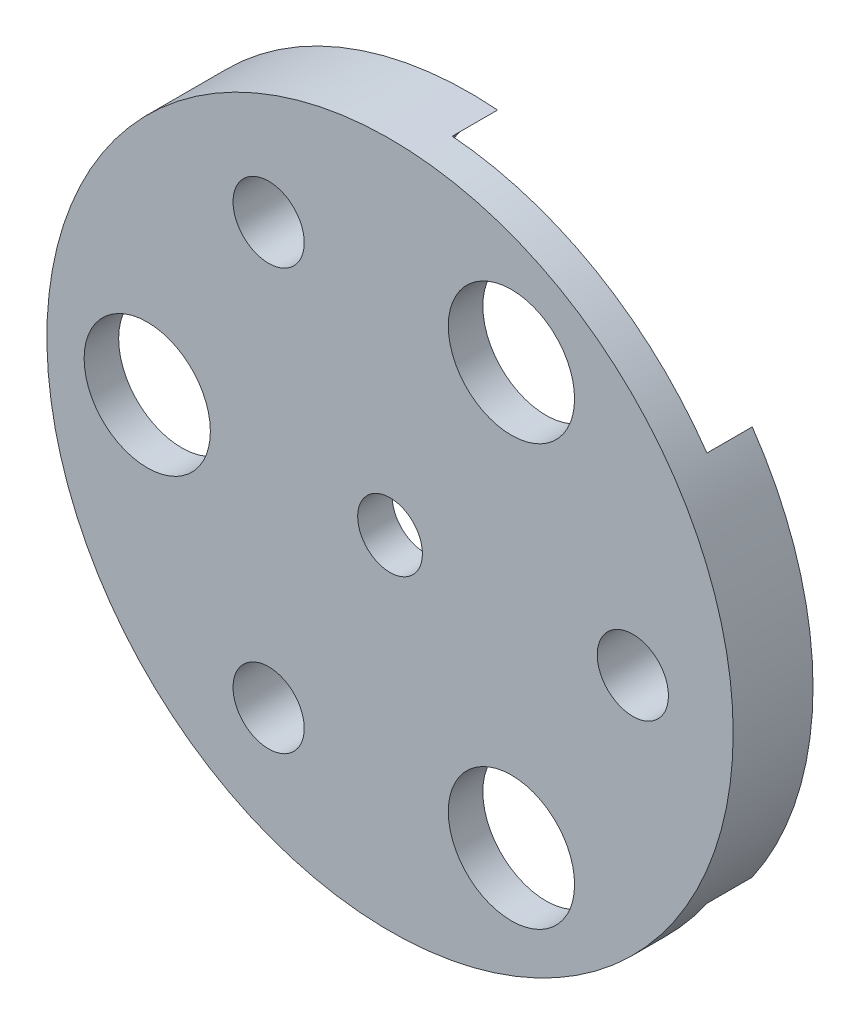
ISO-10303-21;
HEADER;
FILE_DESCRIPTION(('STEP AP214'),'2;1');
FILE_NAME('part.step','',(''),(''),'','','');
FILE_SCHEMA(('AUTOMOTIVE_DESIGN { 1 0 10303 214 1 1 1 1 }'));
ENDSEC;
DATA;
#1=APPLICATION_CONTEXT('core data for automotive mechanical design processes');
#2=APPLICATION_PROTOCOL_DEFINITION('international standard','automotive_design',2000,#1);
#3=PRODUCT_CONTEXT('',#1,'mechanical');
#4=PRODUCT('Part','Part','',(#3));
#5=PRODUCT_RELATED_PRODUCT_CATEGORY('part','',(#4));
#6=PRODUCT_DEFINITION_FORMATION('','',#4);
#7=PRODUCT_DEFINITION_CONTEXT('part definition',#1,'design');
#8=PRODUCT_DEFINITION('design','',#6,#7);
#9=PRODUCT_DEFINITION_SHAPE('','',#8);
#10=(LENGTH_UNIT() NAMED_UNIT(*) SI_UNIT(.MILLI.,.METRE.));
#11=(NAMED_UNIT(*) PLANE_ANGLE_UNIT() SI_UNIT($,.RADIAN.));
#12=(NAMED_UNIT(*) SI_UNIT($,.STERADIAN.) SOLID_ANGLE_UNIT());
#13=UNCERTAINTY_MEASURE_WITH_UNIT(LENGTH_MEASURE(1.E-05),#10,'distance_accuracy_value','');
#14=(GEOMETRIC_REPRESENTATION_CONTEXT(3) GLOBAL_UNCERTAINTY_ASSIGNED_CONTEXT((#13)) GLOBAL_UNIT_ASSIGNED_CONTEXT((#10,
#11,#12)) REPRESENTATION_CONTEXT('',''));
#15=CARTESIAN_POINT('',(0.,0.,0.));
#16=DIRECTION('',(0.,0.,1.));
#17=DIRECTION('',(1.,0.,0.));
#18=AXIS2_PLACEMENT_3D('',#15,#16,#17);
#19=CARTESIAN_POINT('',(169.819947443617,173.617651356682,0.));
#20=DIRECTION('',(0.,0.,1.));
#21=DIRECTION('',(1.,0.,0.));
#22=AXIS2_PLACEMENT_3D('',#19,#20,#21);
#23=PLANE('',#22);
#24=CARTESIAN_POINT('',(164.194947443617,163.874865564107,0.));
#25=DIRECTION('',(0.,0.,1.));
#26=DIRECTION('',(1.,0.,0.));
#27=AXIS2_PLACEMENT_3D('',#24,#25,#26);
#28=CIRCLE('',#27,1.65000000000001);
#29=CARTESIAN_POINT('',(165.844947443617,163.874865564107,0.));
#30=VERTEX_POINT('',#29);
#31=EDGE_CURVE('E216',#30,#30,#28,.T.);
#32=ORIENTED_EDGE('',*,*,#31,.T.);
#33=EDGE_LOOP('',(#32));
#34=FACE_BOUND('',#33,.T.);
#35=CARTESIAN_POINT('',(169.819947443617,173.617651356682,0.));
#36=DIRECTION('',(0.,0.,1.));
#37=DIRECTION('',(1.,0.,0.));
#38=AXIS2_PLACEMENT_3D('',#35,#36,#37);
#39=CIRCLE('',#38,15.9);
#40=CARTESIAN_POINT('',(155.453613863203,166.804541974303,0.));
#41=VERTEX_POINT('',#40);
#42=CARTESIAN_POINT('',(171.102788429923,157.769486825612,0.));
#43=VERTEX_POINT('',#42);
#44=EDGE_CURVE('E169',#41,#43,#39,.T.);
#45=ORIENTED_EDGE('',*,*,#44,.F.);
#46=CARTESIAN_POINT('',(158.569947443617,173.617651356682,0.));
#47=DIRECTION('',(0.,0.,-1.));
#48=DIRECTION('',(-1.,0.,0.));
#49=AXIS2_PLACEMENT_3D('',#46,#47,#48);
#50=CIRCLE('',#49,7.4919953577583);
#51=CARTESIAN_POINT('',(164.29045907,168.779703323363,0.));
#52=VERTEX_POINT('',#51);
#53=EDGE_CURVE('E111',#52,#41,#50,.T.);
#54=ORIENTED_EDGE('',*,*,#53,.F.);
#55=CARTESIAN_POINT('',(169.819947443617,173.617651356682,0.));
#56=DIRECTION('',(0.,0.,-1.));
#57=DIRECTION('',(-1.,0.,0.));
#58=AXIS2_PLACEMENT_3D('',#55,#56,#57);
#59=CIRCLE('',#58,7.34717516104373);
#60=CARTESIAN_POINT('',(168.394905731383,166.409999938539,0.));
#61=VERTEX_POINT('',#60);
#62=EDGE_CURVE('E314',#61,#52,#59,.T.);
#63=ORIENTED_EDGE('',*,*,#62,.F.);
#64=CARTESIAN_POINT('',(175.444947443617,163.874865564107,0.));
#65=DIRECTION('',(0.,0.,-1.));
#66=DIRECTION('',(-1.,0.,0.));
#67=AXIS2_PLACEMENT_3D('',#64,#65,#66);
#68=CIRCLE('',#67,7.4919953577583);
#69=EDGE_CURVE('E360',#43,#61,#68,.T.);
#70=ORIENTED_EDGE('',*,*,#69,.F.);
#71=EDGE_LOOP('',(#45,#54,#63,#70));
#72=FACE_BOUND('',#71,.T.);
#73=ADVANCED_FACE('F43',(#34,#72),#23,.F.);
#74=CARTESIAN_POINT('',(181.069947443617,173.617651356682,0.));
#75=DIRECTION('',(0.,0.,1.));
#76=DIRECTION('',(1.,0.,0.));
#77=AXIS2_PLACEMENT_3D('',#74,#75,#76);
#78=CIRCLE('',#77,1.65000000000002);
#79=CARTESIAN_POINT('',(182.719947443617,173.617651356682,0.));
#80=VERTEX_POINT('',#79);
#81=EDGE_CURVE('E235',#80,#80,#78,.T.);
#82=ORIENTED_EDGE('',*,*,#81,.T.);
#83=EDGE_LOOP('',(#82));
#84=FACE_BOUND('',#83,.T.);
#85=CARTESIAN_POINT('',(182.903440037726,164.58259620799,0.));
#86=VERTEX_POINT('',#85);
#87=CARTESIAN_POINT('',(182.903440037726,182.652706505373,0.));
#88=VERTEX_POINT('',#87);
#89=EDGE_CURVE('E47',#86,#88,#39,.T.);
#90=ORIENTED_EDGE('',*,*,#89,.F.);
#91=CARTESIAN_POINT('',(176.774477529469,171.247947971858,0.));
#92=VERTEX_POINT('',#91);
#93=EDGE_CURVE('E357',#92,#86,#68,.T.);
#94=ORIENTED_EDGE('',*,*,#93,.F.);
#95=CARTESIAN_POINT('',(176.774477529469,175.987354741505,0.));
#96=VERTEX_POINT('',#95);
#97=EDGE_CURVE('E353',#96,#92,#59,.T.);
#98=ORIENTED_EDGE('',*,*,#97,.F.);
#99=CARTESIAN_POINT('',(175.444947443617,183.360437149256,0.));
#100=DIRECTION('',(0.,0.,-1.));
#101=DIRECTION('',(-1.,0.,0.));
#102=AXIS2_PLACEMENT_3D('',#99,#100,#101);
#103=CIRCLE('',#102,7.49199535775831);
#104=EDGE_CURVE('E356',#88,#96,#103,.T.);
#105=ORIENTED_EDGE('',*,*,#104,.F.);
#106=EDGE_LOOP('',(#90,#94,#98,#105));
#107=FACE_BOUND('',#106,.T.);
#108=ADVANCED_FACE('F244',(#84,#107),#23,.F.);
#109=CARTESIAN_POINT('',(158.569947443617,173.617651356682,3.7));
#110=DIRECTION('',(0.,0.,-1.));
#111=DIRECTION('',(-1.,0.,0.));
#112=AXIS2_PLACEMENT_3D('',#109,#110,#111);
#113=CYLINDRICAL_SURFACE('',#112,2.92500000000001);
#114=CARTESIAN_POINT('',(158.569947443617,173.617651356682,3.7));
#115=DIRECTION('',(0.,0.,1.));
#116=DIRECTION('',(1.,0.,0.));
#117=AXIS2_PLACEMENT_3D('',#114,#115,#116);
#118=CIRCLE('',#117,2.92500000000001);
#119=CARTESIAN_POINT('',(161.494947443617,173.617651356682,3.7));
#120=VERTEX_POINT('',#119);
#121=EDGE_CURVE('E231',#120,#120,#118,.T.);
#122=ORIENTED_EDGE('',*,*,#121,.T.);
#123=EDGE_LOOP('',(#122));
#124=FACE_BOUND('',#123,.T.);
#125=CARTESIAN_POINT('',(158.569947443617,173.617651356682,2.1));
#126=DIRECTION('',(0.,0.,-1.));
#127=DIRECTION('',(-1.,0.,0.));
#128=AXIS2_PLACEMENT_3D('',#125,#126,#127);
#129=CIRCLE('',#128,2.92500000000001);
#130=CARTESIAN_POINT('',(155.644947443617,173.617651356682,2.1));
#131=VERTEX_POINT('',#130);
#132=EDGE_CURVE('E304',#131,#131,#129,.F.);
#133=ORIENTED_EDGE('',*,*,#132,.F.);
#134=EDGE_LOOP('',(#133));
#135=FACE_BOUND('',#134,.T.);
#136=ADVANCED_FACE('F265',(#124,#135),#113,.F.);
#137=CARTESIAN_POINT('',(169.819947443617,173.617651356682,3.7));
#138=DIRECTION('',(0.,0.,-1.));
#139=DIRECTION('',(-1.,0.,0.));
#140=AXIS2_PLACEMENT_3D('',#137,#138,#139);
#141=CYLINDRICAL_SURFACE('',#140,1.5);
#142=CARTESIAN_POINT('',(169.819947443617,173.617651356682,3.7));
#143=DIRECTION('',(0.,0.,1.));
#144=DIRECTION('',(1.,0.,0.));
#145=AXIS2_PLACEMENT_3D('',#142,#143,#144);
#146=CIRCLE('',#145,1.5);
#147=CARTESIAN_POINT('',(171.319947443617,173.617651356682,3.7));
#148=VERTEX_POINT('',#147);
#149=EDGE_CURVE('E224',#148,#148,#146,.T.);
#150=ORIENTED_EDGE('',*,*,#149,.T.);
#151=EDGE_LOOP('',(#150));
#152=FACE_BOUND('',#151,.T.);
#153=CARTESIAN_POINT('',(169.819947443617,173.617651356682,2.1));
#154=DIRECTION('',(0.,0.,-1.));
#155=DIRECTION('',(-1.,0.,0.));
#156=AXIS2_PLACEMENT_3D('',#153,#154,#155);
#157=CIRCLE('',#156,1.5);
#158=CARTESIAN_POINT('',(168.319947443617,173.617651356682,2.1));
#159=VERTEX_POINT('',#158);
#160=EDGE_CURVE('E335',#159,#159,#157,.F.);
#161=ORIENTED_EDGE('',*,*,#160,.F.);
#162=EDGE_LOOP('',(#161));
#163=FACE_BOUND('',#162,.T.);
#164=ADVANCED_FACE('F294',(#152,#163),#141,.F.);
#165=CARTESIAN_POINT('',(175.444947443617,183.360437149256,3.7));
#166=DIRECTION('',(0.,0.,-1.));
#167=DIRECTION('',(-1.,0.,0.));
#168=AXIS2_PLACEMENT_3D('',#165,#166,#167);
#169=CYLINDRICAL_SURFACE('',#168,2.925);
#170=CARTESIAN_POINT('',(175.444947443617,183.360437149256,3.7));
#171=DIRECTION('',(0.,0.,1.));
#172=DIRECTION('',(1.,0.,0.));
#173=AXIS2_PLACEMENT_3D('',#170,#171,#172);
#174=CIRCLE('',#173,2.925);
#175=CARTESIAN_POINT('',(178.369947443617,183.360437149256,3.7));
#176=VERTEX_POINT('',#175);
#177=EDGE_CURVE('E206',#176,#176,#174,.T.);
#178=ORIENTED_EDGE('',*,*,#177,.T.);
#179=EDGE_LOOP('',(#178));
#180=FACE_BOUND('',#179,.T.);
#181=CARTESIAN_POINT('',(175.444947443617,183.360437149256,2.1));
#182=DIRECTION('',(0.,0.,-1.));
#183=DIRECTION('',(-1.,0.,0.));
#184=AXIS2_PLACEMENT_3D('',#181,#182,#183);
#185=CIRCLE('',#184,2.925);
#186=CARTESIAN_POINT('',(172.519947443617,183.360437149256,2.1));
#187=VERTEX_POINT('',#186);
#188=EDGE_CURVE('E202',#187,#187,#185,.F.);
#189=ORIENTED_EDGE('',*,*,#188,.F.);
#190=EDGE_LOOP('',(#189));
#191=FACE_BOUND('',#190,.T.);
#192=ADVANCED_FACE('F291',(#180,#191),#169,.F.);
#193=CARTESIAN_POINT('',(175.444947443617,163.874865564107,3.7));
#194=DIRECTION('',(0.,0.,-1.));
#195=DIRECTION('',(-1.,0.,0.));
#196=AXIS2_PLACEMENT_3D('',#193,#194,#195);
#197=CYLINDRICAL_SURFACE('',#196,2.92499999999997);
#198=CARTESIAN_POINT('',(175.444947443617,163.874865564107,3.7));
#199=DIRECTION('',(0.,0.,1.));
#200=DIRECTION('',(1.,0.,0.));
#201=AXIS2_PLACEMENT_3D('',#198,#199,#200);
#202=CIRCLE('',#201,2.92499999999997);
#203=CARTESIAN_POINT('',(178.369947443617,163.874865564107,3.7));
#204=VERTEX_POINT('',#203);
#205=EDGE_CURVE('E203',#204,#204,#202,.T.);
#206=ORIENTED_EDGE('',*,*,#205,.T.);
#207=EDGE_LOOP('',(#206));
#208=FACE_BOUND('',#207,.T.);
#209=CARTESIAN_POINT('',(175.444947443617,163.874865564107,2.1));
#210=DIRECTION('',(0.,0.,-1.));
#211=DIRECTION('',(-1.,0.,0.));
#212=AXIS2_PLACEMENT_3D('',#209,#210,#211);
#213=CIRCLE('',#212,2.92499999999997);
#214=CARTESIAN_POINT('',(172.519947443617,163.874865564107,2.1));
#215=VERTEX_POINT('',#214);
#216=EDGE_CURVE('E339',#215,#215,#213,.F.);
#217=ORIENTED_EDGE('',*,*,#216,.F.);
#218=EDGE_LOOP('',(#217));
#219=FACE_BOUND('',#218,.T.);
#220=ADVANCED_FACE('F272',(#208,#219),#197,.F.);
#221=CARTESIAN_POINT('',(169.819947443617,173.617651356682,3.7));
#222=DIRECTION('',(0.,0.,1.));
#223=DIRECTION('',(1.,0.,0.));
#224=AXIS2_PLACEMENT_3D('',#221,#222,#223);
#225=PLANE('',#224);
#226=ORIENTED_EDGE('',*,*,#177,.F.);
#227=EDGE_LOOP('',(#226));
#228=FACE_BOUND('',#227,.T.);
#229=CARTESIAN_POINT('',(164.194947443617,163.874865564107,3.7));
#230=DIRECTION('',(0.,0.,1.));
#231=DIRECTION('',(1.,0.,0.));
#232=AXIS2_PLACEMENT_3D('',#229,#230,#231);
#233=CIRCLE('',#232,1.65000000000001);
#234=CARTESIAN_POINT('',(165.844947443617,163.874865564107,3.7));
#235=VERTEX_POINT('',#234);
#236=EDGE_CURVE('E220',#235,#235,#233,.T.);
#237=ORIENTED_EDGE('',*,*,#236,.F.);
#238=EDGE_LOOP('',(#237));
#239=FACE_BOUND('',#238,.T.);
#240=ORIENTED_EDGE('',*,*,#121,.F.);
#241=EDGE_LOOP('',(#240));
#242=FACE_BOUND('',#241,.T.);
#243=CARTESIAN_POINT('',(169.819947443617,173.617651356682,3.7));
#244=DIRECTION('',(0.,0.,1.));
#245=DIRECTION('',(1.,0.,0.));
#246=AXIS2_PLACEMENT_3D('',#243,#244,#245);
#247=CIRCLE('',#246,15.9);
#248=CARTESIAN_POINT('',(185.719947443617,173.617651356682,3.7));
#249=VERTEX_POINT('',#248);
#250=EDGE_CURVE('E11',#249,#249,#247,.T.);
#251=ORIENTED_EDGE('',*,*,#250,.T.);
#252=EDGE_LOOP('',(#251));
#253=FACE_BOUND('',#252,.T.);
#254=CARTESIAN_POINT('',(181.069947443617,173.617651356682,3.7));
#255=DIRECTION('',(0.,0.,1.));
#256=DIRECTION('',(1.,0.,0.));
#257=AXIS2_PLACEMENT_3D('',#254,#255,#256);
#258=CIRCLE('',#257,1.65000000000002);
#259=CARTESIAN_POINT('',(182.719947443617,173.617651356682,3.7));
#260=VERTEX_POINT('',#259);
#261=EDGE_CURVE('E236',#260,#260,#258,.T.);
#262=ORIENTED_EDGE('',*,*,#261,.F.);
#263=EDGE_LOOP('',(#262));
#264=FACE_BOUND('',#263,.T.);
#265=ORIENTED_EDGE('',*,*,#149,.F.);
#266=EDGE_LOOP('',(#265));
#267=FACE_BOUND('',#266,.T.);
#268=CARTESIAN_POINT('',(164.194947443617,183.360437149256,3.7));
#269=DIRECTION('',(0.,0.,1.));
#270=DIRECTION('',(1.,0.,0.));
#271=AXIS2_PLACEMENT_3D('',#268,#269,#270);
#272=CIRCLE('',#271,1.65);
#273=CARTESIAN_POINT('',(165.844947443617,183.360437149256,3.7));
#274=VERTEX_POINT('',#273);
#275=EDGE_CURVE('E212',#274,#274,#272,.T.);
#276=ORIENTED_EDGE('',*,*,#275,.F.);
#277=EDGE_LOOP('',(#276));
#278=FACE_BOUND('',#277,.T.);
#279=ORIENTED_EDGE('',*,*,#205,.F.);
#280=EDGE_LOOP('',(#279));
#281=FACE_BOUND('',#280,.T.);
#282=ADVANCED_FACE('F268',(#228,#239,#242,#253,#264,#267,#278,#281),#225,.T.);
#283=CARTESIAN_POINT('',(171.102788429923,189.465815887751,0.));
#284=VERTEX_POINT('',#283);
#285=CARTESIAN_POINT('',(155.453613863203,180.43076073906,0.));
#286=VERTEX_POINT('',#285);
#287=EDGE_CURVE('E53',#284,#286,#39,.T.);
#288=ORIENTED_EDGE('',*,*,#287,.F.);
#289=CARTESIAN_POINT('',(168.394905731383,180.825302774824,0.));
#290=VERTEX_POINT('',#289);
#291=EDGE_CURVE('E352',#290,#284,#103,.T.);
#292=ORIENTED_EDGE('',*,*,#291,.F.);
#293=CARTESIAN_POINT('',(164.29045907,178.45559939,0.));
#294=VERTEX_POINT('',#293);
#295=EDGE_CURVE('E348',#294,#290,#59,.T.);
#296=ORIENTED_EDGE('',*,*,#295,.F.);
#297=EDGE_CURVE('E316',#286,#294,#50,.T.);
#298=ORIENTED_EDGE('',*,*,#297,.F.);
#299=EDGE_LOOP('',(#288,#292,#296,#298));
#300=FACE_BOUND('',#299,.T.);
#301=CARTESIAN_POINT('',(164.194947443617,183.360437149256,0.));
#302=DIRECTION('',(0.,0.,1.));
#303=DIRECTION('',(1.,0.,0.));
#304=AXIS2_PLACEMENT_3D('',#301,#302,#303);
#305=CIRCLE('',#304,1.65);
#306=CARTESIAN_POINT('',(165.844947443617,183.360437149256,0.));
#307=VERTEX_POINT('',#306);
#308=EDGE_CURVE('E211',#307,#307,#305,.T.);
#309=ORIENTED_EDGE('',*,*,#308,.T.);
#310=EDGE_LOOP('',(#309));
#311=FACE_BOUND('',#310,.T.);
#312=ADVANCED_FACE('F258',(#300,#311),#23,.F.);
#313=CARTESIAN_POINT('',(169.819947443617,173.617651356682,3.7));
#314=DIRECTION('',(0.,0.,-1.));
#315=DIRECTION('',(-1.,0.,0.));
#316=AXIS2_PLACEMENT_3D('',#313,#314,#315);
#317=CYLINDRICAL_SURFACE('',#316,15.9);
#318=ORIENTED_EDGE('',*,*,#89,.T.);
#319=DIRECTION('',(0.,0.,-1.));
#320=VECTOR('',#319,1.);
#321=CARTESIAN_POINT('',(182.903440037726,182.652706505373,2.1));
#322=LINE('',#321,#320);
#323=CARTESIAN_POINT('',(182.903440037726,182.652706505373,2.1));
#324=VERTEX_POINT('',#323);
#325=EDGE_CURVE('E186',#324,#88,#322,.T.);
#326=ORIENTED_EDGE('',*,*,#325,.F.);
#327=CARTESIAN_POINT('',(169.819947443617,173.617651356682,2.1));
#328=DIRECTION('',(0.,0.,-1.));
#329=DIRECTION('',(-1.,0.,0.));
#330=AXIS2_PLACEMENT_3D('',#327,#328,#329);
#331=CIRCLE('',#330,15.9);
#332=CARTESIAN_POINT('',(171.102788429923,189.465815887751,2.1));
#333=VERTEX_POINT('',#332);
#334=EDGE_CURVE('E329',#333,#324,#331,.T.);
#335=ORIENTED_EDGE('',*,*,#334,.F.);
#336=DIRECTION('',(0.,0.,-1.));
#337=VECTOR('',#336,1.);
#338=CARTESIAN_POINT('',(171.102788429923,189.465815887751,2.1));
#339=LINE('',#338,#337);
#340=EDGE_CURVE('E189',#333,#284,#339,.T.);
#341=ORIENTED_EDGE('',*,*,#340,.T.);
#342=ORIENTED_EDGE('',*,*,#287,.T.);
#343=DIRECTION('',(0.,0.,-1.));
#344=VECTOR('',#343,1.);
#345=CARTESIAN_POINT('',(155.453613863203,180.43076073906,2.1));
#346=LINE('',#345,#344);
#347=CARTESIAN_POINT('',(155.453613863203,180.43076073906,2.1));
#348=VERTEX_POINT('',#347);
#349=EDGE_CURVE('E199',#348,#286,#346,.T.);
#350=ORIENTED_EDGE('',*,*,#349,.F.);
#351=CARTESIAN_POINT('',(169.819947443617,173.617651356682,2.1));
#352=DIRECTION('',(0.,0.,-1.));
#353=DIRECTION('',(-1.,0.,0.));
#354=AXIS2_PLACEMENT_3D('',#351,#352,#353);
#355=CIRCLE('',#354,15.9);
#356=CARTESIAN_POINT('',(155.453613863203,166.804541974303,2.1));
#357=VERTEX_POINT('',#356);
#358=EDGE_CURVE('E307',#357,#348,#355,.T.);
#359=ORIENTED_EDGE('',*,*,#358,.F.);
#360=DIRECTION('',(0.,0.,-1.));
#361=VECTOR('',#360,1.);
#362=CARTESIAN_POINT('',(155.453613863203,166.804541974303,2.1));
#363=LINE('',#362,#361);
#364=EDGE_CURVE('E207',#357,#41,#363,.T.);
#365=ORIENTED_EDGE('',*,*,#364,.T.);
#366=ORIENTED_EDGE('',*,*,#44,.T.);
#367=DIRECTION('',(0.,0.,-1.));
#368=VECTOR('',#367,1.);
#369=CARTESIAN_POINT('',(171.102788429923,157.769486825612,2.1));
#370=LINE('',#369,#368);
#371=CARTESIAN_POINT('',(171.102788429923,157.769486825612,2.1));
#372=VERTEX_POINT('',#371);
#373=EDGE_CURVE('E147',#372,#43,#370,.T.);
#374=ORIENTED_EDGE('',*,*,#373,.F.);
#375=CARTESIAN_POINT('',(169.819947443617,173.617651356682,2.1));
#376=DIRECTION('',(0.,0.,-1.));
#377=DIRECTION('',(-1.,0.,0.));
#378=AXIS2_PLACEMENT_3D('',#375,#376,#377);
#379=CIRCLE('',#378,15.9);
#380=CARTESIAN_POINT('',(182.903440037726,164.58259620799,2.1));
#381=VERTEX_POINT('',#380);
#382=EDGE_CURVE('E152',#381,#372,#379,.T.);
#383=ORIENTED_EDGE('',*,*,#382,.F.);
#384=DIRECTION('',(0.,0.,-1.));
#385=VECTOR('',#384,1.);
#386=CARTESIAN_POINT('',(182.903440037726,164.58259620799,2.1));
#387=LINE('',#386,#385);
#388=EDGE_CURVE('E171',#381,#86,#387,.T.);
#389=ORIENTED_EDGE('',*,*,#388,.T.);
#390=EDGE_LOOP('',(#318,#326,#335,#341,#342,#350,#359,#365,#366,#374,#383,#389));
#391=FACE_BOUND('',#390,.T.);
#392=ORIENTED_EDGE('',*,*,#250,.F.);
#393=EDGE_LOOP('',(#392));
#394=FACE_BOUND('',#393,.T.);
#395=ADVANCED_FACE('F45',(#391,#394),#317,.T.);
#396=CARTESIAN_POINT('',(181.069947443617,173.617651356682,3.7));
#397=DIRECTION('',(0.,0.,-1.));
#398=DIRECTION('',(-1.,0.,0.));
#399=AXIS2_PLACEMENT_3D('',#396,#397,#398);
#400=CYLINDRICAL_SURFACE('',#399,1.65000000000002);
#401=ORIENTED_EDGE('',*,*,#261,.T.);
#402=EDGE_LOOP('',(#401));
#403=FACE_BOUND('',#402,.T.);
#404=ORIENTED_EDGE('',*,*,#81,.F.);
#405=EDGE_LOOP('',(#404));
#406=FACE_BOUND('',#405,.T.);
#407=ADVANCED_FACE('F247',(#403,#406),#400,.F.);
#408=CARTESIAN_POINT('',(164.194947443617,163.874865564107,3.7));
#409=DIRECTION('',(0.,0.,-1.));
#410=DIRECTION('',(-1.,0.,0.));
#411=AXIS2_PLACEMENT_3D('',#408,#409,#410);
#412=CYLINDRICAL_SURFACE('',#411,1.65000000000001);
#413=ORIENTED_EDGE('',*,*,#236,.T.);
#414=EDGE_LOOP('',(#413));
#415=FACE_BOUND('',#414,.T.);
#416=ORIENTED_EDGE('',*,*,#31,.F.);
#417=EDGE_LOOP('',(#416));
#418=FACE_BOUND('',#417,.T.);
#419=ADVANCED_FACE('F249',(#415,#418),#412,.F.);
#420=CARTESIAN_POINT('',(164.194947443617,183.360437149256,3.7));
#421=DIRECTION('',(0.,0.,-1.));
#422=DIRECTION('',(-1.,0.,0.));
#423=AXIS2_PLACEMENT_3D('',#420,#421,#422);
#424=CYLINDRICAL_SURFACE('',#423,1.65);
#425=ORIENTED_EDGE('',*,*,#275,.T.);
#426=EDGE_LOOP('',(#425));
#427=FACE_BOUND('',#426,.T.);
#428=ORIENTED_EDGE('',*,*,#308,.F.);
#429=EDGE_LOOP('',(#428));
#430=FACE_BOUND('',#429,.T.);
#431=ADVANCED_FACE('F255',(#427,#430),#424,.F.);
#432=CARTESIAN_POINT('',(158.569947443617,173.617651356682,2.1));
#433=DIRECTION('',(0.,0.,-1.));
#434=DIRECTION('',(-1.,0.,0.));
#435=AXIS2_PLACEMENT_3D('',#432,#433,#434);
#436=CYLINDRICAL_SURFACE('',#435,7.4919953577583);
#437=ORIENTED_EDGE('',*,*,#53,.T.);
#438=ORIENTED_EDGE('',*,*,#364,.F.);
#439=CARTESIAN_POINT('',(158.569947443617,173.617651356682,2.1));
#440=DIRECTION('',(0.,0.,-1.));
#441=DIRECTION('',(-1.,0.,0.));
#442=AXIS2_PLACEMENT_3D('',#439,#440,#441);
#443=CIRCLE('',#442,7.4919953577583);
#444=CARTESIAN_POINT('',(164.29045907,168.779703323363,2.1));
#445=VERTEX_POINT('',#444);
#446=EDGE_CURVE('E60',#445,#357,#443,.T.);
#447=ORIENTED_EDGE('',*,*,#446,.F.);
#448=DIRECTION('',(0.,0.,-1.));
#449=VECTOR('',#448,1.);
#450=CARTESIAN_POINT('',(164.29045907,168.779703323363,2.1));
#451=LINE('',#450,#449);
#452=EDGE_CURVE('E69',#445,#52,#451,.T.);
#453=ORIENTED_EDGE('',*,*,#452,.T.);
#454=EDGE_LOOP('',(#437,#438,#447,#453));
#455=FACE_BOUND('',#454,.T.);
#456=ADVANCED_FACE('F282',(#455),#436,.F.);
#457=CARTESIAN_POINT('',(169.819947443617,173.617651356682,2.1));
#458=DIRECTION('',(0.,0.,-1.));
#459=DIRECTION('',(-1.,0.,0.));
#460=AXIS2_PLACEMENT_3D('',#457,#458,#459);
#461=CYLINDRICAL_SURFACE('',#460,7.34717516104373);
#462=ORIENTED_EDGE('',*,*,#62,.T.);
#463=ORIENTED_EDGE('',*,*,#452,.F.);
#464=CARTESIAN_POINT('',(169.819947443617,173.617651356682,2.1));
#465=DIRECTION('',(0.,0.,-1.));
#466=DIRECTION('',(-1.,0.,0.));
#467=AXIS2_PLACEMENT_3D('',#464,#465,#466);
#468=CIRCLE('',#467,7.34717516104373);
#469=CARTESIAN_POINT('',(168.394905731383,166.409999938539,2.1));
#470=VERTEX_POINT('',#469);
#471=EDGE_CURVE('E151',#470,#445,#468,.T.);
#472=ORIENTED_EDGE('',*,*,#471,.F.);
#473=DIRECTION('',(0.,0.,-1.));
#474=VECTOR('',#473,1.);
#475=CARTESIAN_POINT('',(168.394905731383,166.409999938539,2.1));
#476=LINE('',#475,#474);
#477=EDGE_CURVE('E149',#470,#61,#476,.T.);
#478=ORIENTED_EDGE('',*,*,#477,.T.);
#479=EDGE_LOOP('',(#462,#463,#472,#478));
#480=FACE_BOUND('',#479,.T.);
#481=ADVANCED_FACE('F287',(#480),#461,.F.);
#482=CARTESIAN_POINT('',(175.444947443617,163.874865564107,2.1));
#483=DIRECTION('',(0.,0.,-1.));
#484=DIRECTION('',(-1.,0.,0.));
#485=AXIS2_PLACEMENT_3D('',#482,#483,#484);
#486=CYLINDRICAL_SURFACE('',#485,7.4919953577583);
#487=ORIENTED_EDGE('',*,*,#69,.T.);
#488=ORIENTED_EDGE('',*,*,#477,.F.);
#489=CARTESIAN_POINT('',(175.444947443617,163.874865564107,2.1));
#490=DIRECTION('',(0.,0.,-1.));
#491=DIRECTION('',(-1.,0.,0.));
#492=AXIS2_PLACEMENT_3D('',#489,#490,#491);
#493=CIRCLE('',#492,7.4919953577583);
#494=EDGE_CURVE('E142',#372,#470,#493,.T.);
#495=ORIENTED_EDGE('',*,*,#494,.F.);
#496=ORIENTED_EDGE('',*,*,#373,.T.);
#497=EDGE_LOOP('',(#487,#488,#495,#496));
#498=FACE_BOUND('',#497,.T.);
#499=ADVANCED_FACE('F145',(#498),#486,.F.);
#500=ORIENTED_EDGE('',*,*,#93,.T.);
#501=ORIENTED_EDGE('',*,*,#388,.F.);
#502=CARTESIAN_POINT('',(176.774477529469,171.247947971858,2.1));
#503=VERTEX_POINT('',#502);
#504=EDGE_CURVE('E154',#503,#381,#493,.T.);
#505=ORIENTED_EDGE('',*,*,#504,.F.);
#506=DIRECTION('',(0.,0.,-1.));
#507=VECTOR('',#506,1.);
#508=CARTESIAN_POINT('',(176.774477529469,171.247947971858,2.1));
#509=LINE('',#508,#507);
#510=EDGE_CURVE('E178',#503,#92,#509,.T.);
#511=ORIENTED_EDGE('',*,*,#510,.T.);
#512=EDGE_LOOP('',(#500,#501,#505,#511));
#513=FACE_BOUND('',#512,.T.);
#514=ADVANCED_FACE('F404',(#513),#486,.F.);
#515=ORIENTED_EDGE('',*,*,#97,.T.);
#516=ORIENTED_EDGE('',*,*,#510,.F.);
#517=CARTESIAN_POINT('',(176.774477529469,175.987354741505,2.1));
#518=VERTEX_POINT('',#517);
#519=EDGE_CURVE('E325',#518,#503,#468,.T.);
#520=ORIENTED_EDGE('',*,*,#519,.F.);
#521=DIRECTION('',(0.,0.,-1.));
#522=VECTOR('',#521,1.);
#523=CARTESIAN_POINT('',(176.774477529469,175.987354741505,2.1));
#524=LINE('',#523,#522);
#525=EDGE_CURVE('E183',#518,#96,#524,.T.);
#526=ORIENTED_EDGE('',*,*,#525,.T.);
#527=EDGE_LOOP('',(#515,#516,#520,#526));
#528=FACE_BOUND('',#527,.T.);
#529=ADVANCED_FACE('F381',(#528),#461,.F.);
#530=CARTESIAN_POINT('',(175.444947443617,183.360437149256,2.1));
#531=DIRECTION('',(0.,0.,-1.));
#532=DIRECTION('',(-1.,0.,0.));
#533=AXIS2_PLACEMENT_3D('',#530,#531,#532);
#534=CYLINDRICAL_SURFACE('',#533,7.49199535775831);
#535=ORIENTED_EDGE('',*,*,#104,.T.);
#536=ORIENTED_EDGE('',*,*,#525,.F.);
#537=CARTESIAN_POINT('',(175.444947443617,183.360437149256,2.1));
#538=DIRECTION('',(0.,0.,-1.));
#539=DIRECTION('',(-1.,0.,0.));
#540=AXIS2_PLACEMENT_3D('',#537,#538,#539);
#541=CIRCLE('',#540,7.49199535775831);
#542=EDGE_CURVE('E330',#324,#518,#541,.T.);
#543=ORIENTED_EDGE('',*,*,#542,.F.);
#544=ORIENTED_EDGE('',*,*,#325,.T.);
#545=EDGE_LOOP('',(#535,#536,#543,#544));
#546=FACE_BOUND('',#545,.T.);
#547=ADVANCED_FACE('F384',(#546),#534,.F.);
#548=ORIENTED_EDGE('',*,*,#291,.T.);
#549=ORIENTED_EDGE('',*,*,#340,.F.);
#550=CARTESIAN_POINT('',(168.394905731383,180.825302774824,2.1));
#551=VERTEX_POINT('',#550);
#552=EDGE_CURVE('E324',#551,#333,#541,.T.);
#553=ORIENTED_EDGE('',*,*,#552,.F.);
#554=DIRECTION('',(0.,0.,-1.));
#555=VECTOR('',#554,1.);
#556=CARTESIAN_POINT('',(168.394905731383,180.825302774824,2.1));
#557=LINE('',#556,#555);
#558=EDGE_CURVE('E193',#551,#290,#557,.T.);
#559=ORIENTED_EDGE('',*,*,#558,.T.);
#560=EDGE_LOOP('',(#548,#549,#553,#559));
#561=FACE_BOUND('',#560,.T.);
#562=ADVANCED_FACE('F388',(#561),#534,.F.);
#563=ORIENTED_EDGE('',*,*,#295,.T.);
#564=ORIENTED_EDGE('',*,*,#558,.F.);
#565=CARTESIAN_POINT('',(164.29045907,178.45559939,2.1));
#566=VERTEX_POINT('',#565);
#567=EDGE_CURVE('E320',#566,#551,#468,.T.);
#568=ORIENTED_EDGE('',*,*,#567,.F.);
#569=DIRECTION('',(0.,0.,-1.));
#570=VECTOR('',#569,1.);
#571=CARTESIAN_POINT('',(164.29045907,178.45559939,2.1));
#572=LINE('',#571,#570);
#573=EDGE_CURVE('E196',#566,#294,#572,.T.);
#574=ORIENTED_EDGE('',*,*,#573,.T.);
#575=EDGE_LOOP('',(#563,#564,#568,#574));
#576=FACE_BOUND('',#575,.T.);
#577=ADVANCED_FACE('F391',(#576),#461,.F.);
#578=ORIENTED_EDGE('',*,*,#297,.T.);
#579=ORIENTED_EDGE('',*,*,#573,.F.);
#580=EDGE_CURVE('E119',#348,#566,#443,.T.);
#581=ORIENTED_EDGE('',*,*,#580,.F.);
#582=ORIENTED_EDGE('',*,*,#349,.T.);
#583=EDGE_LOOP('',(#578,#579,#581,#582));
#584=FACE_BOUND('',#583,.T.);
#585=ADVANCED_FACE('F289',(#584),#436,.F.);
#586=CARTESIAN_POINT('',(0.,0.,2.1));
#587=DIRECTION('',(0.,0.,-1.));
#588=DIRECTION('',(-1.,0.,0.));
#589=AXIS2_PLACEMENT_3D('',#586,#587,#588);
#590=PLANE('',#589);
#591=ORIENTED_EDGE('',*,*,#132,.T.);
#592=EDGE_LOOP('',(#591));
#593=FACE_BOUND('',#592,.T.);
#594=ORIENTED_EDGE('',*,*,#358,.T.);
#595=ORIENTED_EDGE('',*,*,#580,.T.);
#596=ORIENTED_EDGE('',*,*,#567,.T.);
#597=ORIENTED_EDGE('',*,*,#552,.T.);
#598=ORIENTED_EDGE('',*,*,#334,.T.);
#599=ORIENTED_EDGE('',*,*,#542,.T.);
#600=ORIENTED_EDGE('',*,*,#519,.T.);
#601=ORIENTED_EDGE('',*,*,#504,.T.);
#602=ORIENTED_EDGE('',*,*,#382,.T.);
#603=ORIENTED_EDGE('',*,*,#494,.T.);
#604=ORIENTED_EDGE('',*,*,#471,.T.);
#605=ORIENTED_EDGE('',*,*,#446,.T.);
#606=EDGE_LOOP('',(#594,#595,#596,#597,#598,#599,#600,#601,#602,#603,#604,#605));
#607=FACE_BOUND('',#606,.T.);
#608=ORIENTED_EDGE('',*,*,#160,.T.);
#609=EDGE_LOOP('',(#608));
#610=FACE_BOUND('',#609,.T.);
#611=ORIENTED_EDGE('',*,*,#216,.T.);
#612=EDGE_LOOP('',(#611));
#613=FACE_BOUND('',#612,.T.);
#614=ORIENTED_EDGE('',*,*,#188,.T.);
#615=EDGE_LOOP('',(#614));
#616=FACE_BOUND('',#615,.T.);
#617=ADVANCED_FACE('F157',(#593,#607,#610,#613,#616),#590,.T.);
#618=CLOSED_SHELL('',(#73,#108,#136,#164,#192,#220,#282,#312,#395,#407,#419,#431,#456,#481,#499,
#514,#529,#547,#562,#577,#585,#617));
#619=MANIFOLD_SOLID_BREP('B2',#618);
#620=ADVANCED_BREP_SHAPE_REPRESENTATION('',(#18,#619),#14);
#621=SHAPE_DEFINITION_REPRESENTATION(#9,#620);
ENDSEC;
END-ISO-10303-21;
